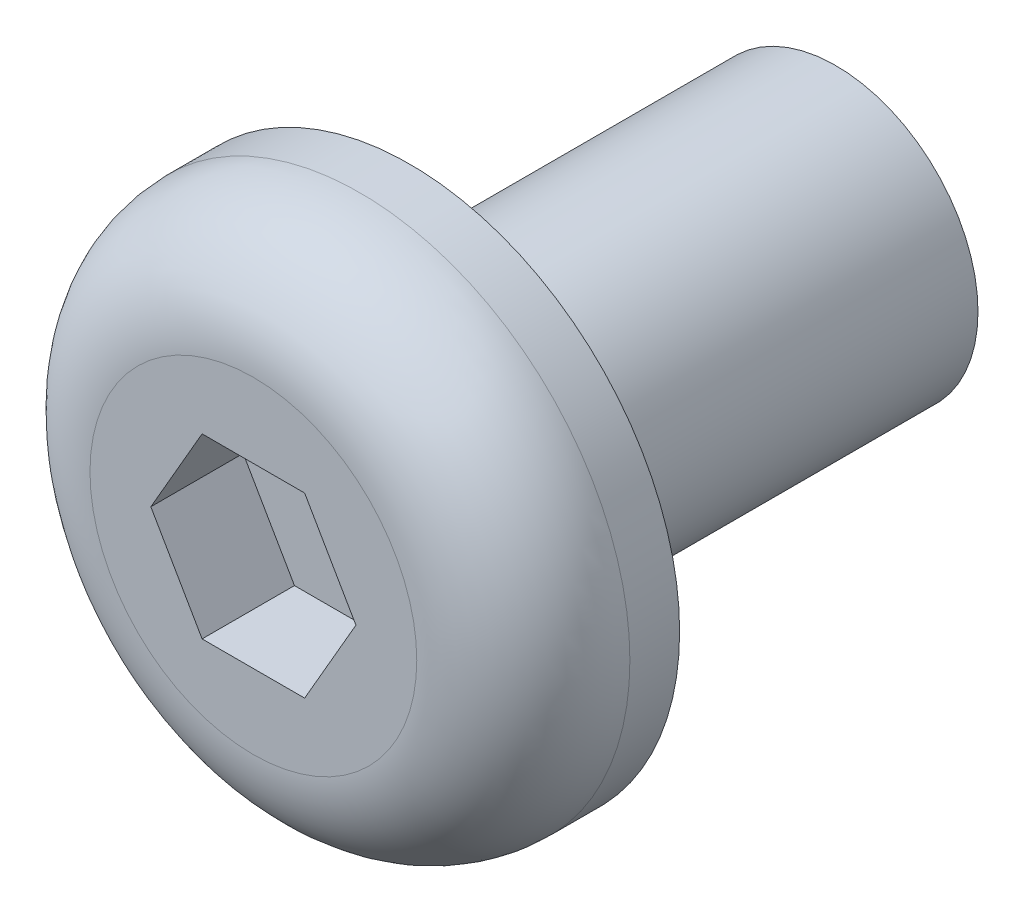
ISO-10303-21;
HEADER;
FILE_DESCRIPTION(('STEP AP214'),'2;1');
FILE_NAME('part.step','',(''),(''),'','','');
FILE_SCHEMA(('AUTOMOTIVE_DESIGN { 1 0 10303 214 1 1 1 1 }'));
ENDSEC;
DATA;
#1=APPLICATION_CONTEXT('core data for automotive mechanical design processes');
#2=APPLICATION_PROTOCOL_DEFINITION('international standard','automotive_design',2000,#1);
#3=PRODUCT_CONTEXT('',#1,'mechanical');
#4=PRODUCT('Part','Part','',(#3));
#5=PRODUCT_RELATED_PRODUCT_CATEGORY('part','',(#4));
#6=PRODUCT_DEFINITION_FORMATION('','',#4);
#7=PRODUCT_DEFINITION_CONTEXT('part definition',#1,'design');
#8=PRODUCT_DEFINITION('design','',#6,#7);
#9=PRODUCT_DEFINITION_SHAPE('','',#8);
#10=(LENGTH_UNIT() NAMED_UNIT(*) SI_UNIT(.MILLI.,.METRE.));
#11=(NAMED_UNIT(*) PLANE_ANGLE_UNIT() SI_UNIT($,.RADIAN.));
#12=(NAMED_UNIT(*) SI_UNIT($,.STERADIAN.) SOLID_ANGLE_UNIT());
#13=UNCERTAINTY_MEASURE_WITH_UNIT(LENGTH_MEASURE(1.E-05),#10,'distance_accuracy_value','');
#14=(GEOMETRIC_REPRESENTATION_CONTEXT(3) GLOBAL_UNCERTAINTY_ASSIGNED_CONTEXT((#13)) GLOBAL_UNIT_ASSIGNED_CONTEXT((#10,
#11,#12)) REPRESENTATION_CONTEXT('',''));
#15=CARTESIAN_POINT('',(0.,0.,0.));
#16=DIRECTION('',(0.,0.,1.));
#17=DIRECTION('',(1.,0.,0.));
#18=AXIS2_PLACEMENT_3D('',#15,#16,#17);
#19=CARTESIAN_POINT('',(0.,0.,8.2));
#20=DIRECTION('',(0.,0.,1.));
#21=DIRECTION('',(1.,0.,0.));
#22=AXIS2_PLACEMENT_3D('',#19,#20,#21);
#23=PLANE('',#22);
#24=CARTESIAN_POINT('',(0.,0.,8.2));
#25=DIRECTION('',(0.,0.,1.));
#26=DIRECTION('',(1.,0.,0.));
#27=AXIS2_PLACEMENT_3D('',#24,#25,#26);
#28=CIRCLE('',#27,2.3);
#29=CARTESIAN_POINT('',(2.3,0.,8.2));
#30=VERTEX_POINT('',#29);
#31=EDGE_CURVE('E47',#30,#30,#28,.T.);
#32=ORIENTED_EDGE('',*,*,#31,.T.);
#33=EDGE_LOOP('',(#32));
#34=FACE_BOUND('',#33,.T.);
#35=DIRECTION('',(-0.5,0.866025403784439,0.));
#36=VECTOR('',#35,1.);
#37=CARTESIAN_POINT('',(1.44337567297406,0.,8.2));
#38=LINE('',#37,#36);
#39=CARTESIAN_POINT('',(1.44337567297406,0.,8.2));
#40=VERTEX_POINT('',#39);
#41=CARTESIAN_POINT('',(0.721687836487032,1.25,8.2));
#42=VERTEX_POINT('',#41);
#43=EDGE_CURVE('E114',#40,#42,#38,.T.);
#44=ORIENTED_EDGE('',*,*,#43,.F.);
#45=DIRECTION('',(0.5,0.866025403784438,0.));
#46=VECTOR('',#45,1.);
#47=CARTESIAN_POINT('',(0.721687836487031,-1.25,8.2));
#48=LINE('',#47,#46);
#49=CARTESIAN_POINT('',(0.721687836487031,-1.25,8.2));
#50=VERTEX_POINT('',#49);
#51=EDGE_CURVE('E93',#50,#40,#48,.T.);
#52=ORIENTED_EDGE('',*,*,#51,.F.);
#53=DIRECTION('',(1.,0.,0.));
#54=VECTOR('',#53,1.);
#55=CARTESIAN_POINT('',(-0.721687836487033,-1.25,8.2));
#56=LINE('',#55,#54);
#57=CARTESIAN_POINT('',(-0.721687836487033,-1.25,8.2));
#58=VERTEX_POINT('',#57);
#59=EDGE_CURVE('E60',#58,#50,#56,.T.);
#60=ORIENTED_EDGE('',*,*,#59,.F.);
#61=DIRECTION('',(0.5,-0.866025403784439,0.));
#62=VECTOR('',#61,1.);
#63=CARTESIAN_POINT('',(-1.44337567297406,0.,8.2));
#64=LINE('',#63,#62);
#65=CARTESIAN_POINT('',(-1.44337567297406,0.,8.2));
#66=VERTEX_POINT('',#65);
#67=EDGE_CURVE('E124',#66,#58,#64,.T.);
#68=ORIENTED_EDGE('',*,*,#67,.F.);
#69=DIRECTION('',(-0.5,-0.866025403784439,0.));
#70=VECTOR('',#69,1.);
#71=CARTESIAN_POINT('',(-0.721687836487032,1.25,8.2));
#72=LINE('',#71,#70);
#73=CARTESIAN_POINT('',(-0.721687836487032,1.25,8.2));
#74=VERTEX_POINT('',#73);
#75=EDGE_CURVE('E113',#74,#66,#72,.T.);
#76=ORIENTED_EDGE('',*,*,#75,.F.);
#77=DIRECTION('',(-1.,0.,0.));
#78=VECTOR('',#77,1.);
#79=CARTESIAN_POINT('',(0.721687836487032,1.25,8.2));
#80=LINE('',#79,#78);
#81=EDGE_CURVE('E102',#42,#74,#80,.T.);
#82=ORIENTED_EDGE('',*,*,#81,.F.);
#83=EDGE_LOOP('',(#44,#52,#60,#68,#76,#82));
#84=FACE_BOUND('',#83,.T.);
#85=ADVANCED_FACE('F39',(#34,#84),#23,.T.);
#86=CARTESIAN_POINT('',(0.,0.,6.));
#87=DIRECTION('',(0.,0.,-1.));
#88=DIRECTION('',(-1.,0.,0.));
#89=AXIS2_PLACEMENT_3D('',#86,#87,#88);
#90=CYLINDRICAL_SURFACE('',#89,2.);
#91=CARTESIAN_POINT('',(0.,0.,6.));
#92=DIRECTION('',(0.,0.,1.));
#93=DIRECTION('',(1.,0.,0.));
#94=AXIS2_PLACEMENT_3D('',#91,#92,#93);
#95=CIRCLE('',#94,2.);
#96=CARTESIAN_POINT('',(2.,0.,6.));
#97=VERTEX_POINT('',#96);
#98=EDGE_CURVE('E151',#97,#97,#95,.T.);
#99=ORIENTED_EDGE('',*,*,#98,.F.);
#100=EDGE_LOOP('',(#99));
#101=FACE_BOUND('',#100,.T.);
#102=CARTESIAN_POINT('',(0.,0.,0.));
#103=DIRECTION('',(0.,0.,1.));
#104=DIRECTION('',(1.,0.,0.));
#105=AXIS2_PLACEMENT_3D('',#102,#103,#104);
#106=CIRCLE('',#105,2.);
#107=CARTESIAN_POINT('',(2.,0.,0.));
#108=VERTEX_POINT('',#107);
#109=EDGE_CURVE('E150',#108,#108,#106,.T.);
#110=ORIENTED_EDGE('',*,*,#109,.T.);
#111=EDGE_LOOP('',(#110));
#112=FACE_BOUND('',#111,.T.);
#113=ADVANCED_FACE('F175',(#101,#112),#90,.T.);
#114=CARTESIAN_POINT('',(0.,0.,0.));
#115=DIRECTION('',(0.,0.,1.));
#116=DIRECTION('',(1.,0.,0.));
#117=AXIS2_PLACEMENT_3D('',#114,#115,#116);
#118=PLANE('',#117);
#119=ORIENTED_EDGE('',*,*,#109,.F.);
#120=EDGE_LOOP('',(#119));
#121=FACE_BOUND('',#120,.T.);
#122=ADVANCED_FACE('F180',(#121),#118,.F.);
#123=CARTESIAN_POINT('',(0.,0.,8.2));
#124=DIRECTION('',(0.,0.,-1.));
#125=DIRECTION('',(-1.,0.,0.));
#126=AXIS2_PLACEMENT_3D('',#123,#124,#125);
#127=CYLINDRICAL_SURFACE('',#126,3.8);
#128=CARTESIAN_POINT('',(0.,0.,6.7));
#129=DIRECTION('',(0.,0.,1.));
#130=DIRECTION('',(1.,0.,0.));
#131=AXIS2_PLACEMENT_3D('',#128,#129,#130);
#132=CIRCLE('',#131,3.8);
#133=CARTESIAN_POINT('',(3.8,0.,6.7));
#134=VERTEX_POINT('',#133);
#135=EDGE_CURVE('E11',#134,#134,#132,.F.);
#136=ORIENTED_EDGE('',*,*,#135,.T.);
#137=EDGE_LOOP('',(#136));
#138=FACE_BOUND('',#137,.T.);
#139=CARTESIAN_POINT('',(0.,0.,6.));
#140=DIRECTION('',(0.,0.,1.));
#141=DIRECTION('',(1.,0.,0.));
#142=AXIS2_PLACEMENT_3D('',#139,#140,#141);
#143=CIRCLE('',#142,3.8);
#144=CARTESIAN_POINT('',(3.8,0.,6.));
#145=VERTEX_POINT('',#144);
#146=EDGE_CURVE('E147',#145,#145,#143,.T.);
#147=ORIENTED_EDGE('',*,*,#146,.T.);
#148=EDGE_LOOP('',(#147));
#149=FACE_BOUND('',#148,.T.);
#150=ADVANCED_FACE('F171',(#138,#149),#127,.T.);
#151=CARTESIAN_POINT('',(0.,0.,6.));
#152=DIRECTION('',(0.,0.,1.));
#153=DIRECTION('',(1.,0.,0.));
#154=AXIS2_PLACEMENT_3D('',#151,#152,#153);
#155=PLANE('',#154);
#156=ORIENTED_EDGE('',*,*,#98,.T.);
#157=EDGE_LOOP('',(#156));
#158=FACE_BOUND('',#157,.T.);
#159=ORIENTED_EDGE('',*,*,#146,.F.);
#160=EDGE_LOOP('',(#159));
#161=FACE_BOUND('',#160,.T.);
#162=ADVANCED_FACE('F161',(#158,#161),#155,.F.);
#163=CARTESIAN_POINT('',(0.,0.,6.7));
#164=DIRECTION('',(0.,0.,1.));
#165=DIRECTION('',(1.,0.,0.));
#166=AXIS2_PLACEMENT_3D('',#163,#164,#165);
#167=TOROIDAL_SURFACE('',#166,2.3,1.5);
#168=ORIENTED_EDGE('',*,*,#135,.F.);
#169=EDGE_LOOP('',(#168));
#170=FACE_BOUND('',#169,.T.);
#171=ORIENTED_EDGE('',*,*,#31,.F.);
#172=EDGE_LOOP('',(#171));
#173=FACE_BOUND('',#172,.T.);
#174=ADVANCED_FACE('F41',(#170,#173),#167,.T.);
#175=CARTESIAN_POINT('',(0.721687836487031,-1.25,8.2));
#176=DIRECTION('',(-0.866025403784438,0.5,0.));
#177=DIRECTION('',(-0.5,-0.866025403784438,0.));
#178=AXIS2_PLACEMENT_3D('',#175,#176,#177);
#179=PLANE('',#178);
#180=DIRECTION('',(0.5,0.866025403784438,0.));
#181=VECTOR('',#180,1.);
#182=CARTESIAN_POINT('',(0.721687836487031,-1.25,6.9));
#183=LINE('',#182,#181);
#184=CARTESIAN_POINT('',(0.721687836487031,-1.25,6.9));
#185=VERTEX_POINT('',#184);
#186=CARTESIAN_POINT('',(1.44337567297406,0.,6.9));
#187=VERTEX_POINT('',#186);
#188=EDGE_CURVE('E131',#185,#187,#183,.T.);
#189=ORIENTED_EDGE('',*,*,#188,.F.);
#190=DIRECTION('',(0.,0.,-1.));
#191=VECTOR('',#190,1.);
#192=CARTESIAN_POINT('',(0.721687836487031,-1.25,8.2));
#193=LINE('',#192,#191);
#194=EDGE_CURVE('E130',#50,#185,#193,.T.);
#195=ORIENTED_EDGE('',*,*,#194,.F.);
#196=ORIENTED_EDGE('',*,*,#51,.T.);
#197=DIRECTION('',(0.,0.,-1.));
#198=VECTOR('',#197,1.);
#199=CARTESIAN_POINT('',(1.44337567297406,0.,8.2));
#200=LINE('',#199,#198);
#201=EDGE_CURVE('E145',#40,#187,#200,.T.);
#202=ORIENTED_EDGE('',*,*,#201,.T.);
#203=EDGE_LOOP('',(#189,#195,#196,#202));
#204=FACE_BOUND('',#203,.T.);
#205=ADVANCED_FACE('F160',(#204),#179,.T.);
#206=CARTESIAN_POINT('',(1.44337567297406,0.,8.2));
#207=DIRECTION('',(-0.866025403784439,-0.5,0.));
#208=DIRECTION('',(0.5,-0.866025403784439,0.));
#209=AXIS2_PLACEMENT_3D('',#206,#207,#208);
#210=PLANE('',#209);
#211=DIRECTION('',(-0.5,0.866025403784439,0.));
#212=VECTOR('',#211,1.);
#213=CARTESIAN_POINT('',(1.44337567297406,0.,6.9));
#214=LINE('',#213,#212);
#215=CARTESIAN_POINT('',(0.721687836487032,1.25,6.9));
#216=VERTEX_POINT('',#215);
#217=EDGE_CURVE('E133',#187,#216,#214,.T.);
#218=ORIENTED_EDGE('',*,*,#217,.F.);
#219=ORIENTED_EDGE('',*,*,#201,.F.);
#220=ORIENTED_EDGE('',*,*,#43,.T.);
#221=DIRECTION('',(0.,0.,-1.));
#222=VECTOR('',#221,1.);
#223=CARTESIAN_POINT('',(0.721687836487032,1.25,8.2));
#224=LINE('',#223,#222);
#225=EDGE_CURVE('E109',#42,#216,#224,.T.);
#226=ORIENTED_EDGE('',*,*,#225,.T.);
#227=EDGE_LOOP('',(#218,#219,#220,#226));
#228=FACE_BOUND('',#227,.T.);
#229=ADVANCED_FACE('F168',(#228),#210,.T.);
#230=CARTESIAN_POINT('',(0.721687836487032,1.25,8.2));
#231=DIRECTION('',(0.,-1.,0.));
#232=DIRECTION('',(1.,0.,0.));
#233=AXIS2_PLACEMENT_3D('',#230,#231,#232);
#234=PLANE('',#233);
#235=DIRECTION('',(-1.,0.,0.));
#236=VECTOR('',#235,1.);
#237=CARTESIAN_POINT('',(0.721687836487032,1.25,6.9));
#238=LINE('',#237,#236);
#239=CARTESIAN_POINT('',(-0.721687836487032,1.25,6.9));
#240=VERTEX_POINT('',#239);
#241=EDGE_CURVE('E135',#216,#240,#238,.T.);
#242=ORIENTED_EDGE('',*,*,#241,.F.);
#243=ORIENTED_EDGE('',*,*,#225,.F.);
#244=ORIENTED_EDGE('',*,*,#81,.T.);
#245=DIRECTION('',(0.,0.,-1.));
#246=VECTOR('',#245,1.);
#247=CARTESIAN_POINT('',(-0.721687836487032,1.25,8.2));
#248=LINE('',#247,#246);
#249=EDGE_CURVE('E106',#74,#240,#248,.T.);
#250=ORIENTED_EDGE('',*,*,#249,.T.);
#251=EDGE_LOOP('',(#242,#243,#244,#250));
#252=FACE_BOUND('',#251,.T.);
#253=ADVANCED_FACE('F105',(#252),#234,.T.);
#254=CARTESIAN_POINT('',(-0.721687836487032,1.25,8.2));
#255=DIRECTION('',(0.866025403784439,-0.5,0.));
#256=DIRECTION('',(0.5,0.866025403784439,0.));
#257=AXIS2_PLACEMENT_3D('',#254,#255,#256);
#258=PLANE('',#257);
#259=DIRECTION('',(-0.5,-0.866025403784439,0.));
#260=VECTOR('',#259,1.);
#261=CARTESIAN_POINT('',(-0.721687836487032,1.25,6.9));
#262=LINE('',#261,#260);
#263=CARTESIAN_POINT('',(-1.44337567297406,0.,6.9));
#264=VERTEX_POINT('',#263);
#265=EDGE_CURVE('E120',#240,#264,#262,.T.);
#266=ORIENTED_EDGE('',*,*,#265,.F.);
#267=ORIENTED_EDGE('',*,*,#249,.F.);
#268=ORIENTED_EDGE('',*,*,#75,.T.);
#269=DIRECTION('',(0.,0.,-1.));
#270=VECTOR('',#269,1.);
#271=CARTESIAN_POINT('',(-1.44337567297406,0.,8.2));
#272=LINE('',#271,#270);
#273=EDGE_CURVE('E121',#66,#264,#272,.T.);
#274=ORIENTED_EDGE('',*,*,#273,.T.);
#275=EDGE_LOOP('',(#266,#267,#268,#274));
#276=FACE_BOUND('',#275,.T.);
#277=ADVANCED_FACE('F117',(#276),#258,.T.);
#278=CARTESIAN_POINT('',(-1.44337567297406,0.,8.2));
#279=DIRECTION('',(0.866025403784439,0.5,0.));
#280=DIRECTION('',(-0.5,0.866025403784439,0.));
#281=AXIS2_PLACEMENT_3D('',#278,#279,#280);
#282=PLANE('',#281);
#283=DIRECTION('',(0.5,-0.866025403784439,0.));
#284=VECTOR('',#283,1.);
#285=CARTESIAN_POINT('',(-1.44337567297406,0.,6.9));
#286=LINE('',#285,#284);
#287=CARTESIAN_POINT('',(-0.721687836487033,-1.25,6.9));
#288=VERTEX_POINT('',#287);
#289=EDGE_CURVE('E138',#264,#288,#286,.T.);
#290=ORIENTED_EDGE('',*,*,#289,.F.);
#291=ORIENTED_EDGE('',*,*,#273,.F.);
#292=ORIENTED_EDGE('',*,*,#67,.T.);
#293=DIRECTION('',(0.,0.,-1.));
#294=VECTOR('',#293,1.);
#295=CARTESIAN_POINT('',(-0.721687836487033,-1.25,8.2));
#296=LINE('',#295,#294);
#297=EDGE_CURVE('E54',#58,#288,#296,.T.);
#298=ORIENTED_EDGE('',*,*,#297,.T.);
#299=EDGE_LOOP('',(#290,#291,#292,#298));
#300=FACE_BOUND('',#299,.T.);
#301=ADVANCED_FACE('F243',(#300),#282,.T.);
#302=CARTESIAN_POINT('',(-0.721687836487033,-1.25,8.2));
#303=DIRECTION('',(0.,1.,0.));
#304=DIRECTION('',(-1.,0.,0.));
#305=AXIS2_PLACEMENT_3D('',#302,#303,#304);
#306=PLANE('',#305);
#307=DIRECTION('',(1.,0.,0.));
#308=VECTOR('',#307,1.);
#309=CARTESIAN_POINT('',(-0.721687836487033,-1.25,6.9));
#310=LINE('',#309,#308);
#311=EDGE_CURVE('E86',#288,#185,#310,.T.);
#312=ORIENTED_EDGE('',*,*,#311,.F.);
#313=ORIENTED_EDGE('',*,*,#297,.F.);
#314=ORIENTED_EDGE('',*,*,#59,.T.);
#315=ORIENTED_EDGE('',*,*,#194,.T.);
#316=EDGE_LOOP('',(#312,#313,#314,#315));
#317=FACE_BOUND('',#316,.T.);
#318=ADVANCED_FACE('F251',(#317),#306,.T.);
#319=CARTESIAN_POINT('',(0.,0.,6.9));
#320=DIRECTION('',(0.,0.,1.));
#321=DIRECTION('',(1.,0.,0.));
#322=AXIS2_PLACEMENT_3D('',#319,#320,#321);
#323=PLANE('',#322);
#324=ORIENTED_EDGE('',*,*,#188,.T.);
#325=ORIENTED_EDGE('',*,*,#217,.T.);
#326=ORIENTED_EDGE('',*,*,#241,.T.);
#327=ORIENTED_EDGE('',*,*,#265,.T.);
#328=ORIENTED_EDGE('',*,*,#289,.T.);
#329=ORIENTED_EDGE('',*,*,#311,.T.);
#330=EDGE_LOOP('',(#324,#325,#326,#327,#328,#329));
#331=FACE_BOUND('',#330,.T.);
#332=ADVANCED_FACE('F260',(#331),#323,.T.);
#333=CLOSED_SHELL('',(#85,#113,#122,#150,#162,#174,#205,#229,#253,#277,#301,#318,#332));
#334=MANIFOLD_SOLID_BREP('B2',#333);
#335=ADVANCED_BREP_SHAPE_REPRESENTATION('',(#18,#334),#14);
#336=SHAPE_DEFINITION_REPRESENTATION(#9,#335);
ENDSEC;
END-ISO-10303-21;
